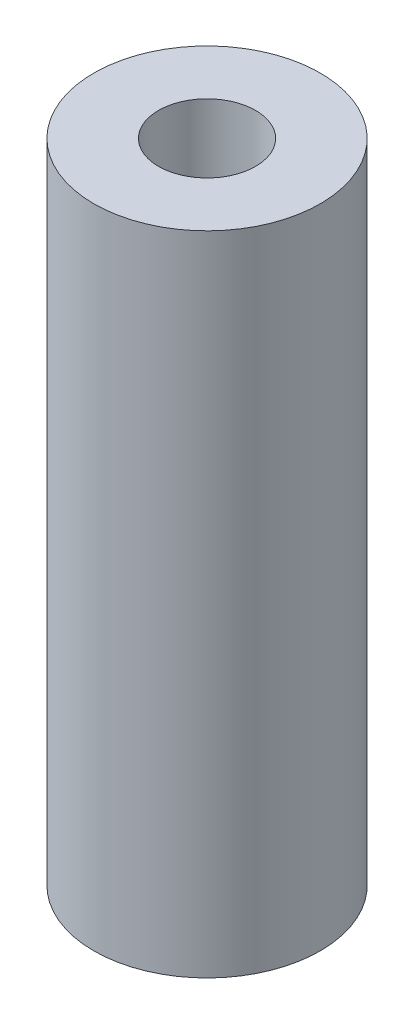
ISO-10303-21;
HEADER;
FILE_DESCRIPTION(('STEP AP214'),'2;1');
FILE_NAME('part.step','',(''),(''),'','','');
FILE_SCHEMA(('AUTOMOTIVE_DESIGN { 1 0 10303 214 1 1 1 1 }'));
ENDSEC;
DATA;
#1=APPLICATION_CONTEXT('core data for automotive mechanical design processes');
#2=APPLICATION_PROTOCOL_DEFINITION('international standard','automotive_design',2000,#1);
#3=PRODUCT_CONTEXT('',#1,'mechanical');
#4=PRODUCT('Part','Part','',(#3));
#5=PRODUCT_RELATED_PRODUCT_CATEGORY('part','',(#4));
#6=PRODUCT_DEFINITION_FORMATION('','',#4);
#7=PRODUCT_DEFINITION_CONTEXT('part definition',#1,'design');
#8=PRODUCT_DEFINITION('design','',#6,#7);
#9=PRODUCT_DEFINITION_SHAPE('','',#8);
#10=(LENGTH_UNIT() NAMED_UNIT(*) SI_UNIT(.MILLI.,.METRE.));
#11=(NAMED_UNIT(*) PLANE_ANGLE_UNIT() SI_UNIT($,.RADIAN.));
#12=(NAMED_UNIT(*) SI_UNIT($,.STERADIAN.) SOLID_ANGLE_UNIT());
#13=UNCERTAINTY_MEASURE_WITH_UNIT(LENGTH_MEASURE(1.E-05),#10,'distance_accuracy_value','');
#14=(GEOMETRIC_REPRESENTATION_CONTEXT(3) GLOBAL_UNCERTAINTY_ASSIGNED_CONTEXT((#13)) GLOBAL_UNIT_ASSIGNED_CONTEXT((#10,
#11,#12)) REPRESENTATION_CONTEXT('',''));
#15=CARTESIAN_POINT('',(0.,0.,0.));
#16=DIRECTION('',(0.,0.,1.));
#17=DIRECTION('',(1.,0.,0.));
#18=AXIS2_PLACEMENT_3D('',#15,#16,#17);
#19=CARTESIAN_POINT('',(0.,20.,0.));
#20=DIRECTION('',(0.,1.,0.));
#21=DIRECTION('',(0.,0.,1.));
#22=AXIS2_PLACEMENT_3D('',#19,#20,#21);
#23=PLANE('',#22);
#24=CARTESIAN_POINT('',(0.,20.,0.));
#25=DIRECTION('',(0.,1.,0.));
#26=DIRECTION('',(0.,0.,1.));
#27=AXIS2_PLACEMENT_3D('',#24,#25,#26);
#28=CIRCLE('',#27,3.5);
#29=CARTESIAN_POINT('',(0.,20.,3.5));
#30=VERTEX_POINT('',#29);
#31=EDGE_CURVE('E10',#30,#30,#28,.T.);
#32=ORIENTED_EDGE('',*,*,#31,.T.);
#33=EDGE_LOOP('',(#32));
#34=FACE_BOUND('',#33,.T.);
#35=CARTESIAN_POINT('',(0.,20.,0.));
#36=DIRECTION('',(0.,1.,0.));
#37=DIRECTION('',(0.,0.,1.));
#38=AXIS2_PLACEMENT_3D('',#35,#36,#37);
#39=CIRCLE('',#38,1.5);
#40=CARTESIAN_POINT('',(0.,20.,1.5));
#41=VERTEX_POINT('',#40);
#42=EDGE_CURVE('E50',#41,#41,#39,.T.);
#43=ORIENTED_EDGE('',*,*,#42,.F.);
#44=EDGE_LOOP('',(#43));
#45=FACE_BOUND('',#44,.T.);
#46=ADVANCED_FACE('F37',(#34,#45),#23,.T.);
#47=CARTESIAN_POINT('',(0.,0.,0.));
#48=DIRECTION('',(0.,1.,0.));
#49=DIRECTION('',(0.,0.,1.));
#50=AXIS2_PLACEMENT_3D('',#47,#48,#49);
#51=PLANE('',#50);
#52=CARTESIAN_POINT('',(0.,0.,0.));
#53=DIRECTION('',(0.,1.,0.));
#54=DIRECTION('',(0.,0.,1.));
#55=AXIS2_PLACEMENT_3D('',#52,#53,#54);
#56=CIRCLE('',#55,3.5);
#57=CARTESIAN_POINT('',(0.,0.,3.5));
#58=VERTEX_POINT('',#57);
#59=EDGE_CURVE('E41',#58,#58,#56,.T.);
#60=ORIENTED_EDGE('',*,*,#59,.F.);
#61=EDGE_LOOP('',(#60));
#62=FACE_BOUND('',#61,.T.);
#63=CARTESIAN_POINT('',(0.,0.,0.));
#64=DIRECTION('',(0.,1.,0.));
#65=DIRECTION('',(0.,0.,1.));
#66=AXIS2_PLACEMENT_3D('',#63,#64,#65);
#67=CIRCLE('',#66,1.5);
#68=CARTESIAN_POINT('',(0.,0.,1.5));
#69=VERTEX_POINT('',#68);
#70=EDGE_CURVE('E52',#69,#69,#67,.T.);
#71=ORIENTED_EDGE('',*,*,#70,.T.);
#72=EDGE_LOOP('',(#71));
#73=FACE_BOUND('',#72,.T.);
#74=ADVANCED_FACE('F64',(#62,#73),#51,.F.);
#75=CARTESIAN_POINT('',(0.,20.,0.));
#76=DIRECTION('',(0.,-1.,0.));
#77=DIRECTION('',(0.,0.,-1.));
#78=AXIS2_PLACEMENT_3D('',#75,#76,#77);
#79=CYLINDRICAL_SURFACE('',#78,3.5);
#80=ORIENTED_EDGE('',*,*,#31,.F.);
#81=EDGE_LOOP('',(#80));
#82=FACE_BOUND('',#81,.T.);
#83=ORIENTED_EDGE('',*,*,#59,.T.);
#84=EDGE_LOOP('',(#83));
#85=FACE_BOUND('',#84,.T.);
#86=ADVANCED_FACE('F39',(#82,#85),#79,.T.);
#87=CARTESIAN_POINT('',(0.,20.,0.));
#88=DIRECTION('',(0.,-1.,0.));
#89=DIRECTION('',(0.,0.,-1.));
#90=AXIS2_PLACEMENT_3D('',#87,#88,#89);
#91=CYLINDRICAL_SURFACE('',#90,1.5);
#92=ORIENTED_EDGE('',*,*,#42,.T.);
#93=EDGE_LOOP('',(#92));
#94=FACE_BOUND('',#93,.T.);
#95=ORIENTED_EDGE('',*,*,#70,.F.);
#96=EDGE_LOOP('',(#95));
#97=FACE_BOUND('',#96,.T.);
#98=ADVANCED_FACE('F60',(#94,#97),#91,.F.);
#99=CLOSED_SHELL('',(#46,#74,#86,#98));
#100=MANIFOLD_SOLID_BREP('B2',#99);
#101=ADVANCED_BREP_SHAPE_REPRESENTATION('',(#18,#100),#14);
#102=SHAPE_DEFINITION_REPRESENTATION(#9,#101);
ENDSEC;
END-ISO-10303-21;
